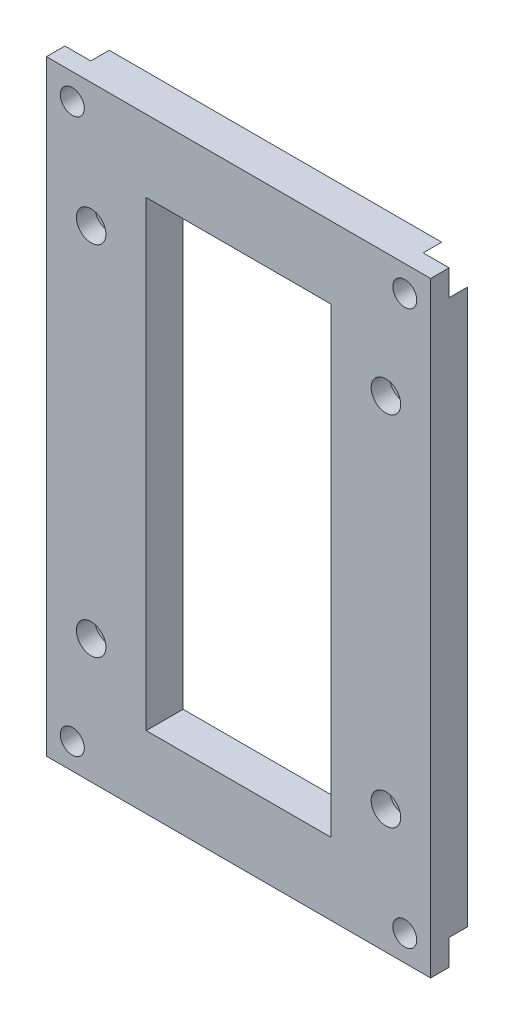
ISO-10303-21;
HEADER;
FILE_DESCRIPTION(('STEP AP214'),'2;1');
FILE_NAME('part.step','',(''),(''),'','','');
FILE_SCHEMA(('AUTOMOTIVE_DESIGN { 1 0 10303 214 1 1 1 1 }'));
ENDSEC;
DATA;
#1=APPLICATION_CONTEXT('core data for automotive mechanical design processes');
#2=APPLICATION_PROTOCOL_DEFINITION('international standard','automotive_design',2000,#1);
#3=PRODUCT_CONTEXT('',#1,'mechanical');
#4=PRODUCT('Part','Part','',(#3));
#5=PRODUCT_RELATED_PRODUCT_CATEGORY('part','',(#4));
#6=PRODUCT_DEFINITION_FORMATION('','',#4);
#7=PRODUCT_DEFINITION_CONTEXT('part definition',#1,'design');
#8=PRODUCT_DEFINITION('design','',#6,#7);
#9=PRODUCT_DEFINITION_SHAPE('','',#8);
#10=(LENGTH_UNIT() NAMED_UNIT(*) SI_UNIT(.MILLI.,.METRE.));
#11=(NAMED_UNIT(*) PLANE_ANGLE_UNIT() SI_UNIT($,.RADIAN.));
#12=(NAMED_UNIT(*) SI_UNIT($,.STERADIAN.) SOLID_ANGLE_UNIT());
#13=UNCERTAINTY_MEASURE_WITH_UNIT(LENGTH_MEASURE(1.E-05),#10,'distance_accuracy_value','');
#14=(GEOMETRIC_REPRESENTATION_CONTEXT(3) GLOBAL_UNCERTAINTY_ASSIGNED_CONTEXT((#13)) GLOBAL_UNIT_ASSIGNED_CONTEXT((#10,
#11,#12)) REPRESENTATION_CONTEXT('',''));
#15=CARTESIAN_POINT('',(0.,0.,0.));
#16=DIRECTION('',(0.,0.,1.));
#17=DIRECTION('',(1.,0.,0.));
#18=AXIS2_PLACEMENT_3D('',#15,#16,#17);
#19=CARTESIAN_POINT('',(-52.,0.,10.));
#20=DIRECTION('',(-1.,0.,0.));
#21=DIRECTION('',(0.,0.,1.));
#22=AXIS2_PLACEMENT_3D('',#19,#20,#21);
#23=PLANE('',#22);
#24=DIRECTION('',(0.,0.,-1.));
#25=VECTOR('',#24,1.);
#26=CARTESIAN_POINT('',(-52.,-75.,5.));
#27=LINE('',#26,#25);
#28=CARTESIAN_POINT('',(-52.,-75.,5.));
#29=VERTEX_POINT('',#28);
#30=CARTESIAN_POINT('',(-52.,-75.,0.));
#31=VERTEX_POINT('',#30);
#32=EDGE_CURVE('E247',#29,#31,#27,.T.);
#33=ORIENTED_EDGE('',*,*,#32,.F.);
#34=DIRECTION('',(0.,1.,0.));
#35=VECTOR('',#34,1.);
#36=CARTESIAN_POINT('',(-52.,0.,5.));
#37=LINE('',#36,#35);
#38=CARTESIAN_POINT('',(-52.,-82.,5.));
#39=VERTEX_POINT('',#38);
#40=EDGE_CURVE('E246',#39,#29,#37,.T.);
#41=ORIENTED_EDGE('',*,*,#40,.F.);
#42=DIRECTION('',(0.,0.,-1.));
#43=VECTOR('',#42,1.);
#44=CARTESIAN_POINT('',(-52.,-82.,10.));
#45=LINE('',#44,#43);
#46=CARTESIAN_POINT('',(-52.,-82.,10.));
#47=VERTEX_POINT('',#46);
#48=EDGE_CURVE('E12',#47,#39,#45,.T.);
#49=ORIENTED_EDGE('',*,*,#48,.F.);
#50=DIRECTION('',(0.,1.,0.));
#51=VECTOR('',#50,1.);
#52=CARTESIAN_POINT('',(-52.,0.,10.));
#53=LINE('',#52,#51);
#54=CARTESIAN_POINT('',(-52.,82.,10.));
#55=VERTEX_POINT('',#54);
#56=EDGE_CURVE('E378',#47,#55,#53,.T.);
#57=ORIENTED_EDGE('',*,*,#56,.T.);
#58=DIRECTION('',(0.,0.,-1.));
#59=VECTOR('',#58,1.);
#60=CARTESIAN_POINT('',(-52.,82.,10.));
#61=LINE('',#60,#59);
#62=CARTESIAN_POINT('',(-52.,82.,5.));
#63=VERTEX_POINT('',#62);
#64=EDGE_CURVE('E393',#55,#63,#61,.T.);
#65=ORIENTED_EDGE('',*,*,#64,.T.);
#66=DIRECTION('',(0.,1.,0.));
#67=VECTOR('',#66,1.);
#68=CARTESIAN_POINT('',(-52.,0.,5.));
#69=LINE('',#68,#67);
#70=CARTESIAN_POINT('',(-52.,75.,5.));
#71=VERTEX_POINT('',#70);
#72=EDGE_CURVE('E232',#71,#63,#69,.T.);
#73=ORIENTED_EDGE('',*,*,#72,.F.);
#74=DIRECTION('',(0.,0.,-1.));
#75=VECTOR('',#74,1.);
#76=CARTESIAN_POINT('',(-52.,75.,5.));
#77=LINE('',#76,#75);
#78=CARTESIAN_POINT('',(-52.,75.,0.));
#79=VERTEX_POINT('',#78);
#80=EDGE_CURVE('E215',#71,#79,#77,.T.);
#81=ORIENTED_EDGE('',*,*,#80,.T.);
#82=DIRECTION('',(0.,1.,0.));
#83=VECTOR('',#82,1.);
#84=CARTESIAN_POINT('',(-52.,0.,0.));
#85=LINE('',#84,#83);
#86=EDGE_CURVE('E360',#31,#79,#85,.T.);
#87=ORIENTED_EDGE('',*,*,#86,.F.);
#88=EDGE_LOOP('',(#33,#41,#49,#57,#65,#73,#81,#87));
#89=FACE_BOUND('',#88,.T.);
#90=ADVANCED_FACE('F52',(#89),#23,.T.);
#91=CARTESIAN_POINT('',(0.,-82.,10.));
#92=DIRECTION('',(0.,-1.,0.));
#93=DIRECTION('',(0.,0.,-1.));
#94=AXIS2_PLACEMENT_3D('',#91,#92,#93);
#95=PLANE('',#94);
#96=DIRECTION('',(0.,0.,-1.));
#97=VECTOR('',#96,1.);
#98=CARTESIAN_POINT('',(45.,-82.,5.));
#99=LINE('',#98,#97);
#100=CARTESIAN_POINT('',(45.,-82.,5.));
#101=VERTEX_POINT('',#100);
#102=CARTESIAN_POINT('',(45.,-82.,0.));
#103=VERTEX_POINT('',#102);
#104=EDGE_CURVE('E214',#101,#103,#99,.T.);
#105=ORIENTED_EDGE('',*,*,#104,.F.);
#106=DIRECTION('',(-1.,0.,0.));
#107=VECTOR('',#106,1.);
#108=CARTESIAN_POINT('',(0.,-82.,5.));
#109=LINE('',#108,#107);
#110=CARTESIAN_POINT('',(52.,-82.,5.));
#111=VERTEX_POINT('',#110);
#112=EDGE_CURVE('E271',#111,#101,#109,.T.);
#113=ORIENTED_EDGE('',*,*,#112,.F.);
#114=DIRECTION('',(0.,0.,-1.));
#115=VECTOR('',#114,1.);
#116=CARTESIAN_POINT('',(52.,-82.,10.));
#117=LINE('',#116,#115);
#118=CARTESIAN_POINT('',(52.,-82.,10.));
#119=VERTEX_POINT('',#118);
#120=EDGE_CURVE('E62',#119,#111,#117,.T.);
#121=ORIENTED_EDGE('',*,*,#120,.F.);
#122=DIRECTION('',(-1.,0.,0.));
#123=VECTOR('',#122,1.);
#124=CARTESIAN_POINT('',(0.,-82.,10.));
#125=LINE('',#124,#123);
#126=EDGE_CURVE('E382',#119,#47,#125,.T.);
#127=ORIENTED_EDGE('',*,*,#126,.T.);
#128=ORIENTED_EDGE('',*,*,#48,.T.);
#129=DIRECTION('',(-1.,0.,0.));
#130=VECTOR('',#129,1.);
#131=CARTESIAN_POINT('',(0.,-82.,5.));
#132=LINE('',#131,#130);
#133=CARTESIAN_POINT('',(-45.,-82.,5.));
#134=VERTEX_POINT('',#133);
#135=EDGE_CURVE('E257',#134,#39,#132,.T.);
#136=ORIENTED_EDGE('',*,*,#135,.F.);
#137=DIRECTION('',(0.,0.,-1.));
#138=VECTOR('',#137,1.);
#139=CARTESIAN_POINT('',(-45.,-82.,5.));
#140=LINE('',#139,#138);
#141=CARTESIAN_POINT('',(-45.,-82.,0.));
#142=VERTEX_POINT('',#141);
#143=EDGE_CURVE('E242',#134,#142,#140,.T.);
#144=ORIENTED_EDGE('',*,*,#143,.T.);
#145=DIRECTION('',(-1.,0.,0.));
#146=VECTOR('',#145,1.);
#147=CARTESIAN_POINT('',(0.,-82.,0.));
#148=LINE('',#147,#146);
#149=EDGE_CURVE('E397',#103,#142,#148,.T.);
#150=ORIENTED_EDGE('',*,*,#149,.F.);
#151=EDGE_LOOP('',(#105,#113,#121,#127,#128,#136,#144,#150));
#152=FACE_BOUND('',#151,.T.);
#153=ADVANCED_FACE('F452',(#152),#95,.T.);
#154=CARTESIAN_POINT('',(52.,0.,10.));
#155=DIRECTION('',(-1.,0.,0.));
#156=DIRECTION('',(0.,0.,1.));
#157=AXIS2_PLACEMENT_3D('',#154,#155,#156);
#158=PLANE('',#157);
#159=DIRECTION('',(0.,-1.,0.));
#160=VECTOR('',#159,1.);
#161=CARTESIAN_POINT('',(52.,0.,5.));
#162=LINE('',#161,#160);
#163=CARTESIAN_POINT('',(52.,-75.,5.));
#164=VERTEX_POINT('',#163);
#165=EDGE_CURVE('E280',#164,#111,#162,.T.);
#166=ORIENTED_EDGE('',*,*,#165,.F.);
#167=DIRECTION('',(0.,0.,-1.));
#168=VECTOR('',#167,1.);
#169=CARTESIAN_POINT('',(52.,-75.,5.));
#170=LINE('',#169,#168);
#171=CARTESIAN_POINT('',(52.,-75.,0.));
#172=VERTEX_POINT('',#171);
#173=EDGE_CURVE('E267',#164,#172,#170,.T.);
#174=ORIENTED_EDGE('',*,*,#173,.T.);
#175=DIRECTION('',(0.,1.,0.));
#176=VECTOR('',#175,1.);
#177=CARTESIAN_POINT('',(52.,0.,0.));
#178=LINE('',#177,#176);
#179=CARTESIAN_POINT('',(52.,75.,0.));
#180=VERTEX_POINT('',#179);
#181=EDGE_CURVE('E401',#172,#180,#178,.T.);
#182=ORIENTED_EDGE('',*,*,#181,.T.);
#183=DIRECTION('',(0.,0.,-1.));
#184=VECTOR('',#183,1.);
#185=CARTESIAN_POINT('',(52.,75.,5.));
#186=LINE('',#185,#184);
#187=CARTESIAN_POINT('',(52.,75.,5.));
#188=VERTEX_POINT('',#187);
#189=EDGE_CURVE('E304',#188,#180,#186,.T.);
#190=ORIENTED_EDGE('',*,*,#189,.F.);
#191=DIRECTION('',(0.,-1.,0.));
#192=VECTOR('',#191,1.);
#193=CARTESIAN_POINT('',(52.,0.,5.));
#194=LINE('',#193,#192);
#195=CARTESIAN_POINT('',(52.,82.,5.));
#196=VERTEX_POINT('',#195);
#197=EDGE_CURVE('E297',#196,#188,#194,.T.);
#198=ORIENTED_EDGE('',*,*,#197,.F.);
#199=DIRECTION('',(0.,0.,-1.));
#200=VECTOR('',#199,1.);
#201=CARTESIAN_POINT('',(52.,82.,10.));
#202=LINE('',#201,#200);
#203=CARTESIAN_POINT('',(52.,82.,10.));
#204=VERTEX_POINT('',#203);
#205=EDGE_CURVE('E411',#204,#196,#202,.T.);
#206=ORIENTED_EDGE('',*,*,#205,.F.);
#207=DIRECTION('',(0.,1.,0.));
#208=VECTOR('',#207,1.);
#209=CARTESIAN_POINT('',(52.,0.,10.));
#210=LINE('',#209,#208);
#211=EDGE_CURVE('E386',#119,#204,#210,.T.);
#212=ORIENTED_EDGE('',*,*,#211,.F.);
#213=ORIENTED_EDGE('',*,*,#120,.T.);
#214=EDGE_LOOP('',(#166,#174,#182,#190,#198,#206,#212,#213));
#215=FACE_BOUND('',#214,.T.);
#216=ADVANCED_FACE('F458',(#215),#158,.F.);
#217=CARTESIAN_POINT('',(45.,75.,10.));
#218=DIRECTION('',(0.,0.,-1.));
#219=DIRECTION('',(-1.,0.,0.));
#220=AXIS2_PLACEMENT_3D('',#217,#218,#219);
#221=CYLINDRICAL_SURFACE('',#220,3.25);
#222=CARTESIAN_POINT('',(45.,75.,10.));
#223=DIRECTION('',(0.,0.,1.));
#224=DIRECTION('',(1.,0.,0.));
#225=AXIS2_PLACEMENT_3D('',#222,#223,#224);
#226=CIRCLE('',#225,3.25);
#227=CARTESIAN_POINT('',(48.25,75.,10.));
#228=VERTEX_POINT('',#227);
#229=EDGE_CURVE('E374',#228,#228,#226,.T.);
#230=ORIENTED_EDGE('',*,*,#229,.T.);
#231=EDGE_LOOP('',(#230));
#232=FACE_BOUND('',#231,.T.);
#233=CARTESIAN_POINT('',(45.,75.,5.));
#234=DIRECTION('',(0.,0.,-1.));
#235=DIRECTION('',(-1.,0.,0.));
#236=AXIS2_PLACEMENT_3D('',#233,#234,#235);
#237=CIRCLE('',#236,3.25);
#238=CARTESIAN_POINT('',(41.75,75.,5.));
#239=VERTEX_POINT('',#238);
#240=EDGE_CURVE('E286',#239,#239,#237,.F.);
#241=ORIENTED_EDGE('',*,*,#240,.F.);
#242=EDGE_LOOP('',(#241));
#243=FACE_BOUND('',#242,.T.);
#244=ADVANCED_FACE('F464',(#232,#243),#221,.F.);
#245=CARTESIAN_POINT('',(45.,-75.,10.));
#246=DIRECTION('',(0.,0.,-1.));
#247=DIRECTION('',(-1.,0.,0.));
#248=AXIS2_PLACEMENT_3D('',#245,#246,#247);
#249=CYLINDRICAL_SURFACE('',#248,3.25);
#250=CARTESIAN_POINT('',(45.,-75.,10.));
#251=DIRECTION('',(0.,0.,1.));
#252=DIRECTION('',(1.,0.,0.));
#253=AXIS2_PLACEMENT_3D('',#250,#251,#252);
#254=CIRCLE('',#253,3.25);
#255=CARTESIAN_POINT('',(48.25,-75.,10.));
#256=VERTEX_POINT('',#255);
#257=EDGE_CURVE('E370',#256,#256,#254,.T.);
#258=ORIENTED_EDGE('',*,*,#257,.T.);
#259=EDGE_LOOP('',(#258));
#260=FACE_BOUND('',#259,.T.);
#261=CARTESIAN_POINT('',(45.,-75.,5.));
#262=DIRECTION('',(0.,0.,-1.));
#263=DIRECTION('',(-1.,0.,0.));
#264=AXIS2_PLACEMENT_3D('',#261,#262,#263);
#265=CIRCLE('',#264,3.25);
#266=CARTESIAN_POINT('',(41.75,-75.,5.));
#267=VERTEX_POINT('',#266);
#268=EDGE_CURVE('E56',#267,#267,#265,.T.);
#269=ORIENTED_EDGE('',*,*,#268,.T.);
#270=EDGE_LOOP('',(#269));
#271=FACE_BOUND('',#270,.T.);
#272=ADVANCED_FACE('F467',(#260,#271),#249,.F.);
#273=CARTESIAN_POINT('',(-45.,75.,10.));
#274=DIRECTION('',(0.,0.,-1.));
#275=DIRECTION('',(-1.,0.,0.));
#276=AXIS2_PLACEMENT_3D('',#273,#274,#275);
#277=CYLINDRICAL_SURFACE('',#276,3.25);
#278=CARTESIAN_POINT('',(-45.,75.,10.));
#279=DIRECTION('',(0.,0.,1.));
#280=DIRECTION('',(1.,0.,0.));
#281=AXIS2_PLACEMENT_3D('',#278,#279,#280);
#282=CIRCLE('',#281,3.25);
#283=CARTESIAN_POINT('',(-41.75,75.,10.));
#284=VERTEX_POINT('',#283);
#285=EDGE_CURVE('E365',#284,#284,#282,.T.);
#286=ORIENTED_EDGE('',*,*,#285,.T.);
#287=EDGE_LOOP('',(#286));
#288=FACE_BOUND('',#287,.T.);
#289=CARTESIAN_POINT('',(-45.,75.,5.));
#290=DIRECTION('',(0.,0.,-1.));
#291=DIRECTION('',(-1.,0.,0.));
#292=AXIS2_PLACEMENT_3D('',#289,#290,#291);
#293=CIRCLE('',#292,3.25);
#294=CARTESIAN_POINT('',(-48.25,75.,5.));
#295=VERTEX_POINT('',#294);
#296=EDGE_CURVE('E228',#295,#295,#293,.F.);
#297=ORIENTED_EDGE('',*,*,#296,.F.);
#298=EDGE_LOOP('',(#297));
#299=FACE_BOUND('',#298,.T.);
#300=ADVANCED_FACE('F470',(#288,#299),#277,.F.);
#301=CARTESIAN_POINT('',(-45.,-75.,10.));
#302=DIRECTION('',(0.,0.,-1.));
#303=DIRECTION('',(-1.,0.,0.));
#304=AXIS2_PLACEMENT_3D('',#301,#302,#303);
#305=CYLINDRICAL_SURFACE('',#304,3.25);
#306=CARTESIAN_POINT('',(-45.,-75.,10.));
#307=DIRECTION('',(0.,0.,1.));
#308=DIRECTION('',(1.,0.,0.));
#309=AXIS2_PLACEMENT_3D('',#306,#307,#308);
#310=CIRCLE('',#309,3.25);
#311=CARTESIAN_POINT('',(-41.75,-75.,10.));
#312=VERTEX_POINT('',#311);
#313=EDGE_CURVE('E361',#312,#312,#310,.T.);
#314=ORIENTED_EDGE('',*,*,#313,.T.);
#315=EDGE_LOOP('',(#314));
#316=FACE_BOUND('',#315,.T.);
#317=CARTESIAN_POINT('',(-45.,-75.,5.));
#318=DIRECTION('',(0.,0.,-1.));
#319=DIRECTION('',(-1.,0.,0.));
#320=AXIS2_PLACEMENT_3D('',#317,#318,#319);
#321=CIRCLE('',#320,3.25);
#322=CARTESIAN_POINT('',(-48.25,-75.,5.));
#323=VERTEX_POINT('',#322);
#324=EDGE_CURVE('E253',#323,#323,#321,.F.);
#325=ORIENTED_EDGE('',*,*,#324,.F.);
#326=EDGE_LOOP('',(#325));
#327=FACE_BOUND('',#326,.T.);
#328=ADVANCED_FACE('F54',(#316,#327),#305,.F.);
#329=CARTESIAN_POINT('',(0.,82.,10.));
#330=DIRECTION('',(0.,-1.,0.));
#331=DIRECTION('',(0.,0.,-1.));
#332=AXIS2_PLACEMENT_3D('',#329,#330,#331);
#333=PLANE('',#332);
#334=DIRECTION('',(0.,0.,-1.));
#335=VECTOR('',#334,1.);
#336=CARTESIAN_POINT('',(-45.,82.,5.));
#337=LINE('',#336,#335);
#338=CARTESIAN_POINT('',(-45.,82.,5.));
#339=VERTEX_POINT('',#338);
#340=CARTESIAN_POINT('',(-45.,82.,0.));
#341=VERTEX_POINT('',#340);
#342=EDGE_CURVE('E220',#339,#341,#337,.T.);
#343=ORIENTED_EDGE('',*,*,#342,.F.);
#344=DIRECTION('',(1.,0.,0.));
#345=VECTOR('',#344,1.);
#346=CARTESIAN_POINT('',(0.,82.,5.));
#347=LINE('',#346,#345);
#348=EDGE_CURVE('E219',#63,#339,#347,.T.);
#349=ORIENTED_EDGE('',*,*,#348,.F.);
#350=ORIENTED_EDGE('',*,*,#64,.F.);
#351=DIRECTION('',(-1.,0.,0.));
#352=VECTOR('',#351,1.);
#353=CARTESIAN_POINT('',(0.,82.,10.));
#354=LINE('',#353,#352);
#355=EDGE_CURVE('E390',#204,#55,#354,.T.);
#356=ORIENTED_EDGE('',*,*,#355,.F.);
#357=ORIENTED_EDGE('',*,*,#205,.T.);
#358=DIRECTION('',(1.,0.,0.));
#359=VECTOR('',#358,1.);
#360=CARTESIAN_POINT('',(0.,82.,5.));
#361=LINE('',#360,#359);
#362=CARTESIAN_POINT('',(45.,82.,5.));
#363=VERTEX_POINT('',#362);
#364=EDGE_CURVE('E294',#363,#196,#361,.T.);
#365=ORIENTED_EDGE('',*,*,#364,.F.);
#366=DIRECTION('',(0.,0.,-1.));
#367=VECTOR('',#366,1.);
#368=CARTESIAN_POINT('',(45.,82.,5.));
#369=LINE('',#368,#367);
#370=CARTESIAN_POINT('',(45.,82.,0.));
#371=VERTEX_POINT('',#370);
#372=EDGE_CURVE('E301',#363,#371,#369,.T.);
#373=ORIENTED_EDGE('',*,*,#372,.T.);
#374=DIRECTION('',(-1.,0.,0.));
#375=VECTOR('',#374,1.);
#376=CARTESIAN_POINT('',(0.,82.,0.));
#377=LINE('',#376,#375);
#378=EDGE_CURVE('E366',#371,#341,#377,.T.);
#379=ORIENTED_EDGE('',*,*,#378,.T.);
#380=EDGE_LOOP('',(#343,#349,#350,#356,#357,#365,#373,#379));
#381=FACE_BOUND('',#380,.T.);
#382=ADVANCED_FACE('F437',(#381),#333,.F.);
#383=CARTESIAN_POINT('',(39.9,48.4,10.));
#384=DIRECTION('',(0.,0.,-1.));
#385=DIRECTION('',(-1.,0.,0.));
#386=AXIS2_PLACEMENT_3D('',#383,#384,#385);
#387=CYLINDRICAL_SURFACE('',#386,1.625);
#388=CARTESIAN_POINT('',(39.9,48.4,0.));
#389=DIRECTION('',(0.,0.,-1.));
#390=DIRECTION('',(-1.,0.,0.));
#391=AXIS2_PLACEMENT_3D('',#388,#389,#390);
#392=CIRCLE('',#391,1.625);
#393=CARTESIAN_POINT('',(38.275,48.4,0.));
#394=VERTEX_POINT('',#393);
#395=EDGE_CURVE('E353',#394,#394,#392,.T.);
#396=ORIENTED_EDGE('',*,*,#395,.T.);
#397=EDGE_LOOP('',(#396));
#398=FACE_BOUND('',#397,.T.);
#399=CARTESIAN_POINT('',(39.9,48.4,5.));
#400=DIRECTION('',(0.,0.,1.));
#401=DIRECTION('',(1.,0.,0.));
#402=AXIS2_PLACEMENT_3D('',#399,#400,#401);
#403=CIRCLE('',#402,1.625);
#404=CARTESIAN_POINT('',(41.525,48.4,5.));
#405=VERTEX_POINT('',#404);
#406=EDGE_CURVE('E348',#405,#405,#403,.F.);
#407=ORIENTED_EDGE('',*,*,#406,.F.);
#408=EDGE_LOOP('',(#407));
#409=FACE_BOUND('',#408,.T.);
#410=ADVANCED_FACE('F434',(#398,#409),#387,.F.);
#411=CARTESIAN_POINT('',(-39.9,-48.4,10.));
#412=DIRECTION('',(0.,0.,-1.));
#413=DIRECTION('',(-1.,0.,0.));
#414=AXIS2_PLACEMENT_3D('',#411,#412,#413);
#415=CYLINDRICAL_SURFACE('',#414,1.625);
#416=CARTESIAN_POINT('',(-39.9,-48.4,0.));
#417=DIRECTION('',(0.,0.,-1.));
#418=DIRECTION('',(-1.,0.,0.));
#419=AXIS2_PLACEMENT_3D('',#416,#417,#418);
#420=CIRCLE('',#419,1.625);
#421=CARTESIAN_POINT('',(-41.525,-48.4,0.));
#422=VERTEX_POINT('',#421);
#423=EDGE_CURVE('E343',#422,#422,#420,.T.);
#424=ORIENTED_EDGE('',*,*,#423,.T.);
#425=EDGE_LOOP('',(#424));
#426=FACE_BOUND('',#425,.T.);
#427=CARTESIAN_POINT('',(-39.9,-48.4,5.));
#428=DIRECTION('',(0.,0.,1.));
#429=DIRECTION('',(1.,0.,0.));
#430=AXIS2_PLACEMENT_3D('',#427,#428,#429);
#431=CIRCLE('',#430,1.625);
#432=CARTESIAN_POINT('',(-38.275,-48.4,5.));
#433=VERTEX_POINT('',#432);
#434=EDGE_CURVE('E425',#433,#433,#431,.F.);
#435=ORIENTED_EDGE('',*,*,#434,.F.);
#436=EDGE_LOOP('',(#435));
#437=FACE_BOUND('',#436,.T.);
#438=ADVANCED_FACE('F436',(#426,#437),#415,.F.);
#439=CARTESIAN_POINT('',(39.9,-48.4,10.));
#440=DIRECTION('',(0.,0.,-1.));
#441=DIRECTION('',(-1.,0.,0.));
#442=AXIS2_PLACEMENT_3D('',#439,#440,#441);
#443=CYLINDRICAL_SURFACE('',#442,1.625);
#444=CARTESIAN_POINT('',(39.9,-48.4,0.));
#445=DIRECTION('',(0.,0.,-1.));
#446=DIRECTION('',(-1.,0.,0.));
#447=AXIS2_PLACEMENT_3D('',#444,#445,#446);
#448=CIRCLE('',#447,1.625);
#449=CARTESIAN_POINT('',(38.275,-48.4,0.));
#450=VERTEX_POINT('',#449);
#451=EDGE_CURVE('E347',#450,#450,#448,.T.);
#452=ORIENTED_EDGE('',*,*,#451,.T.);
#453=EDGE_LOOP('',(#452));
#454=FACE_BOUND('',#453,.T.);
#455=CARTESIAN_POINT('',(39.9,-48.4,5.));
#456=DIRECTION('',(0.,0.,1.));
#457=DIRECTION('',(1.,0.,0.));
#458=AXIS2_PLACEMENT_3D('',#455,#456,#457);
#459=CIRCLE('',#458,1.625);
#460=CARTESIAN_POINT('',(41.525,-48.4,5.));
#461=VERTEX_POINT('',#460);
#462=EDGE_CURVE('E421',#461,#461,#459,.F.);
#463=ORIENTED_EDGE('',*,*,#462,.F.);
#464=EDGE_LOOP('',(#463));
#465=FACE_BOUND('',#464,.T.);
#466=ADVANCED_FACE('F444',(#454,#465),#443,.F.);
#467=CARTESIAN_POINT('',(-39.9,48.4,10.));
#468=DIRECTION('',(0.,0.,-1.));
#469=DIRECTION('',(-1.,0.,0.));
#470=AXIS2_PLACEMENT_3D('',#467,#468,#469);
#471=CYLINDRICAL_SURFACE('',#470,1.625);
#472=CARTESIAN_POINT('',(-39.9,48.4,0.));
#473=DIRECTION('',(0.,0.,-1.));
#474=DIRECTION('',(-1.,0.,0.));
#475=AXIS2_PLACEMENT_3D('',#472,#473,#474);
#476=CIRCLE('',#475,1.625);
#477=CARTESIAN_POINT('',(-41.525,48.4,0.));
#478=VERTEX_POINT('',#477);
#479=EDGE_CURVE('E349',#478,#478,#476,.T.);
#480=ORIENTED_EDGE('',*,*,#479,.T.);
#481=EDGE_LOOP('',(#480));
#482=FACE_BOUND('',#481,.T.);
#483=CARTESIAN_POINT('',(-39.9,48.4,5.));
#484=DIRECTION('',(0.,0.,1.));
#485=DIRECTION('',(1.,0.,0.));
#486=AXIS2_PLACEMENT_3D('',#483,#484,#485);
#487=CIRCLE('',#486,1.625);
#488=CARTESIAN_POINT('',(-38.275,48.4,5.));
#489=VERTEX_POINT('',#488);
#490=EDGE_CURVE('E339',#489,#489,#487,.F.);
#491=ORIENTED_EDGE('',*,*,#490,.F.);
#492=EDGE_LOOP('',(#491));
#493=FACE_BOUND('',#492,.T.);
#494=ADVANCED_FACE('F578',(#482,#493),#471,.F.);
#495=CARTESIAN_POINT('',(0.,0.,10.));
#496=DIRECTION('',(0.,0.,1.));
#497=DIRECTION('',(1.,0.,0.));
#498=AXIS2_PLACEMENT_3D('',#495,#496,#497);
#499=PLANE('',#498);
#500=DIRECTION('',(0.,1.,0.));
#501=VECTOR('',#500,1.);
#502=CARTESIAN_POINT('',(25.,0.,10.));
#503=LINE('',#502,#501);
#504=CARTESIAN_POINT('',(25.,-62.5,10.));
#505=VERTEX_POINT('',#504);
#506=CARTESIAN_POINT('',(25.,62.5,10.));
#507=VERTEX_POINT('',#506);
#508=EDGE_CURVE('E211',#505,#507,#503,.T.);
#509=ORIENTED_EDGE('',*,*,#508,.F.);
#510=DIRECTION('',(1.,0.,0.));
#511=VECTOR('',#510,1.);
#512=CARTESIAN_POINT('',(0.,-62.5,10.));
#513=LINE('',#512,#511);
#514=CARTESIAN_POINT('',(-25.,-62.5,10.));
#515=VERTEX_POINT('',#514);
#516=EDGE_CURVE('E199',#515,#505,#513,.T.);
#517=ORIENTED_EDGE('',*,*,#516,.F.);
#518=DIRECTION('',(0.,-1.,0.));
#519=VECTOR('',#518,1.);
#520=CARTESIAN_POINT('',(-25.,0.,10.));
#521=LINE('',#520,#519);
#522=CARTESIAN_POINT('',(-25.,62.5,10.));
#523=VERTEX_POINT('',#522);
#524=EDGE_CURVE('E174',#523,#515,#521,.T.);
#525=ORIENTED_EDGE('',*,*,#524,.F.);
#526=DIRECTION('',(-1.,0.,0.));
#527=VECTOR('',#526,1.);
#528=CARTESIAN_POINT('',(0.,62.5,10.));
#529=LINE('',#528,#527);
#530=EDGE_CURVE('E208',#507,#523,#529,.T.);
#531=ORIENTED_EDGE('',*,*,#530,.F.);
#532=EDGE_LOOP('',(#509,#517,#525,#531));
#533=FACE_BOUND('',#532,.T.);
#534=CARTESIAN_POINT('',(39.9,48.4,10.));
#535=DIRECTION('',(0.,0.,1.));
#536=DIRECTION('',(1.,0.,0.));
#537=AXIS2_PLACEMENT_3D('',#534,#535,#536);
#538=CIRCLE('',#537,4.);
#539=CARTESIAN_POINT('',(43.9,48.4,10.));
#540=VERTEX_POINT('',#539);
#541=EDGE_CURVE('E324',#540,#540,#538,.T.);
#542=ORIENTED_EDGE('',*,*,#541,.F.);
#543=EDGE_LOOP('',(#542));
#544=FACE_BOUND('',#543,.T.);
#545=CARTESIAN_POINT('',(-39.9,-48.4,10.));
#546=DIRECTION('',(0.,0.,1.));
#547=DIRECTION('',(1.,0.,0.));
#548=AXIS2_PLACEMENT_3D('',#545,#546,#547);
#549=CIRCLE('',#548,4.);
#550=CARTESIAN_POINT('',(-35.9,-48.4,10.));
#551=VERTEX_POINT('',#550);
#552=EDGE_CURVE('E314',#551,#551,#549,.T.);
#553=ORIENTED_EDGE('',*,*,#552,.F.);
#554=EDGE_LOOP('',(#553));
#555=FACE_BOUND('',#554,.T.);
#556=CARTESIAN_POINT('',(39.9,-48.4,10.));
#557=DIRECTION('',(0.,0.,1.));
#558=DIRECTION('',(1.,0.,0.));
#559=AXIS2_PLACEMENT_3D('',#556,#557,#558);
#560=CIRCLE('',#559,4.);
#561=CARTESIAN_POINT('',(43.9,-48.4,10.));
#562=VERTEX_POINT('',#561);
#563=EDGE_CURVE('E315',#562,#562,#560,.T.);
#564=ORIENTED_EDGE('',*,*,#563,.F.);
#565=EDGE_LOOP('',(#564));
#566=FACE_BOUND('',#565,.T.);
#567=CARTESIAN_POINT('',(-39.9,48.4,10.));
#568=DIRECTION('',(0.,0.,1.));
#569=DIRECTION('',(1.,0.,0.));
#570=AXIS2_PLACEMENT_3D('',#567,#568,#569);
#571=CIRCLE('',#570,4.);
#572=CARTESIAN_POINT('',(-35.9,48.4,10.));
#573=VERTEX_POINT('',#572);
#574=EDGE_CURVE('E323',#573,#573,#571,.T.);
#575=ORIENTED_EDGE('',*,*,#574,.F.);
#576=EDGE_LOOP('',(#575));
#577=FACE_BOUND('',#576,.T.);
#578=ORIENTED_EDGE('',*,*,#313,.F.);
#579=EDGE_LOOP('',(#578));
#580=FACE_BOUND('',#579,.T.);
#581=ORIENTED_EDGE('',*,*,#285,.F.);
#582=EDGE_LOOP('',(#581));
#583=FACE_BOUND('',#582,.T.);
#584=ORIENTED_EDGE('',*,*,#257,.F.);
#585=EDGE_LOOP('',(#584));
#586=FACE_BOUND('',#585,.T.);
#587=ORIENTED_EDGE('',*,*,#229,.F.);
#588=EDGE_LOOP('',(#587));
#589=FACE_BOUND('',#588,.T.);
#590=ORIENTED_EDGE('',*,*,#56,.F.);
#591=ORIENTED_EDGE('',*,*,#126,.F.);
#592=ORIENTED_EDGE('',*,*,#211,.T.);
#593=ORIENTED_EDGE('',*,*,#355,.T.);
#594=EDGE_LOOP('',(#590,#591,#592,#593));
#595=FACE_BOUND('',#594,.T.);
#596=ADVANCED_FACE('F510',(#533,#544,#555,#566,#577,#580,#583,#586,#589,#595),#499,.T.);
#597=CARTESIAN_POINT('',(0.,0.,0.));
#598=DIRECTION('',(0.,0.,1.));
#599=DIRECTION('',(1.,0.,0.));
#600=AXIS2_PLACEMENT_3D('',#597,#598,#599);
#601=PLANE('',#600);
#602=DIRECTION('',(-1.,0.,0.));
#603=VECTOR('',#602,1.);
#604=CARTESIAN_POINT('',(-25.,-62.5,0.));
#605=LINE('',#604,#603);
#606=CARTESIAN_POINT('',(25.,-62.5,0.));
#607=VERTEX_POINT('',#606);
#608=CARTESIAN_POINT('',(-25.,-62.5,0.));
#609=VERTEX_POINT('',#608);
#610=EDGE_CURVE('E181',#607,#609,#605,.T.);
#611=ORIENTED_EDGE('',*,*,#610,.F.);
#612=DIRECTION('',(0.,-1.,0.));
#613=VECTOR('',#612,1.);
#614=CARTESIAN_POINT('',(25.,-62.5,0.));
#615=LINE('',#614,#613);
#616=CARTESIAN_POINT('',(25.,62.5,0.));
#617=VERTEX_POINT('',#616);
#618=EDGE_CURVE('E78',#617,#607,#615,.T.);
#619=ORIENTED_EDGE('',*,*,#618,.F.);
#620=DIRECTION('',(1.,0.,0.));
#621=VECTOR('',#620,1.);
#622=CARTESIAN_POINT('',(-25.,62.5,0.));
#623=LINE('',#622,#621);
#624=CARTESIAN_POINT('',(-25.,62.5,0.));
#625=VERTEX_POINT('',#624);
#626=EDGE_CURVE('E189',#625,#617,#623,.T.);
#627=ORIENTED_EDGE('',*,*,#626,.F.);
#628=DIRECTION('',(0.,1.,0.));
#629=VECTOR('',#628,1.);
#630=CARTESIAN_POINT('',(-25.,-62.5,0.));
#631=LINE('',#630,#629);
#632=EDGE_CURVE('E171',#609,#625,#631,.T.);
#633=ORIENTED_EDGE('',*,*,#632,.F.);
#634=EDGE_LOOP('',(#611,#619,#627,#633));
#635=FACE_BOUND('',#634,.T.);
#636=ORIENTED_EDGE('',*,*,#479,.F.);
#637=EDGE_LOOP('',(#636));
#638=FACE_BOUND('',#637,.T.);
#639=ORIENTED_EDGE('',*,*,#451,.F.);
#640=EDGE_LOOP('',(#639));
#641=FACE_BOUND('',#640,.T.);
#642=ORIENTED_EDGE('',*,*,#423,.F.);
#643=EDGE_LOOP('',(#642));
#644=FACE_BOUND('',#643,.T.);
#645=ORIENTED_EDGE('',*,*,#395,.F.);
#646=EDGE_LOOP('',(#645));
#647=FACE_BOUND('',#646,.T.);
#648=ORIENTED_EDGE('',*,*,#181,.F.);
#649=CARTESIAN_POINT('',(45.,-75.,0.));
#650=DIRECTION('',(0.,0.,-1.));
#651=DIRECTION('',(-1.,0.,0.));
#652=AXIS2_PLACEMENT_3D('',#649,#650,#651);
#653=CIRCLE('',#652,7.);
#654=EDGE_CURVE('E250',#103,#172,#653,.T.);
#655=ORIENTED_EDGE('',*,*,#654,.F.);
#656=ORIENTED_EDGE('',*,*,#149,.T.);
#657=CARTESIAN_POINT('',(-45.,-75.,0.));
#658=DIRECTION('',(0.,0.,-1.));
#659=DIRECTION('',(-1.,0.,0.));
#660=AXIS2_PLACEMENT_3D('',#657,#658,#659);
#661=CIRCLE('',#660,7.);
#662=EDGE_CURVE('E223',#31,#142,#661,.T.);
#663=ORIENTED_EDGE('',*,*,#662,.F.);
#664=ORIENTED_EDGE('',*,*,#86,.T.);
#665=CARTESIAN_POINT('',(-45.,75.,0.));
#666=DIRECTION('',(0.,0.,-1.));
#667=DIRECTION('',(-1.,0.,0.));
#668=AXIS2_PLACEMENT_3D('',#665,#666,#667);
#669=CIRCLE('',#668,6.99999999999999);
#670=EDGE_CURVE('E224',#341,#79,#669,.T.);
#671=ORIENTED_EDGE('',*,*,#670,.F.);
#672=ORIENTED_EDGE('',*,*,#378,.F.);
#673=CARTESIAN_POINT('',(45.,75.,0.));
#674=DIRECTION('',(0.,0.,-1.));
#675=DIRECTION('',(-1.,0.,0.));
#676=AXIS2_PLACEMENT_3D('',#673,#674,#675);
#677=CIRCLE('',#676,7.);
#678=EDGE_CURVE('E227',#180,#371,#677,.T.);
#679=ORIENTED_EDGE('',*,*,#678,.F.);
#680=EDGE_LOOP('',(#648,#655,#656,#663,#664,#671,#672,#679));
#681=FACE_BOUND('',#680,.T.);
#682=ADVANCED_FACE('F186',(#635,#638,#641,#644,#647,#681),#601,.F.);
#683=CARTESIAN_POINT('',(-39.9,48.4,5.));
#684=DIRECTION('',(0.,0.,1.));
#685=DIRECTION('',(1.,0.,0.));
#686=AXIS2_PLACEMENT_3D('',#683,#684,#685);
#687=PLANE('',#686);
#688=CARTESIAN_POINT('',(-39.9,48.4,5.));
#689=DIRECTION('',(0.,0.,1.));
#690=DIRECTION('',(1.,0.,0.));
#691=AXIS2_PLACEMENT_3D('',#688,#689,#690);
#692=CIRCLE('',#691,4.);
#693=CARTESIAN_POINT('',(-35.9,48.4,5.));
#694=VERTEX_POINT('',#693);
#695=EDGE_CURVE('E335',#694,#694,#692,.T.);
#696=ORIENTED_EDGE('',*,*,#695,.T.);
#697=EDGE_LOOP('',(#696));
#698=FACE_BOUND('',#697,.T.);
#699=ORIENTED_EDGE('',*,*,#490,.T.);
#700=EDGE_LOOP('',(#699));
#701=FACE_BOUND('',#700,.T.);
#702=ADVANCED_FACE('F571',(#698,#701),#687,.T.);
#703=CARTESIAN_POINT('',(-39.9,48.4,5.));
#704=DIRECTION('',(0.,0.,1.));
#705=DIRECTION('',(1.,0.,0.));
#706=AXIS2_PLACEMENT_3D('',#703,#704,#705);
#707=CYLINDRICAL_SURFACE('',#706,4.);
#708=ORIENTED_EDGE('',*,*,#695,.F.);
#709=EDGE_LOOP('',(#708));
#710=FACE_BOUND('',#709,.T.);
#711=ORIENTED_EDGE('',*,*,#574,.T.);
#712=EDGE_LOOP('',(#711));
#713=FACE_BOUND('',#712,.T.);
#714=ADVANCED_FACE('F552',(#710,#713),#707,.F.);
#715=CARTESIAN_POINT('',(39.9,-48.4,5.));
#716=DIRECTION('',(0.,0.,1.));
#717=DIRECTION('',(1.,0.,0.));
#718=AXIS2_PLACEMENT_3D('',#715,#716,#717);
#719=PLANE('',#718);
#720=CARTESIAN_POINT('',(39.9,-48.4,5.));
#721=DIRECTION('',(0.,0.,1.));
#722=DIRECTION('',(1.,0.,0.));
#723=AXIS2_PLACEMENT_3D('',#720,#721,#722);
#724=CIRCLE('',#723,4.);
#725=CARTESIAN_POINT('',(43.9,-48.4,5.));
#726=VERTEX_POINT('',#725);
#727=EDGE_CURVE('E310',#726,#726,#724,.T.);
#728=ORIENTED_EDGE('',*,*,#727,.T.);
#729=EDGE_LOOP('',(#728));
#730=FACE_BOUND('',#729,.T.);
#731=ORIENTED_EDGE('',*,*,#462,.T.);
#732=EDGE_LOOP('',(#731));
#733=FACE_BOUND('',#732,.T.);
#734=ADVANCED_FACE('F548',(#730,#733),#719,.T.);
#735=CARTESIAN_POINT('',(39.9,-48.4,5.));
#736=DIRECTION('',(0.,0.,1.));
#737=DIRECTION('',(1.,0.,0.));
#738=AXIS2_PLACEMENT_3D('',#735,#736,#737);
#739=CYLINDRICAL_SURFACE('',#738,4.);
#740=ORIENTED_EDGE('',*,*,#727,.F.);
#741=EDGE_LOOP('',(#740));
#742=FACE_BOUND('',#741,.T.);
#743=ORIENTED_EDGE('',*,*,#563,.T.);
#744=EDGE_LOOP('',(#743));
#745=FACE_BOUND('',#744,.T.);
#746=ADVANCED_FACE('F551',(#742,#745),#739,.F.);
#747=CARTESIAN_POINT('',(-39.9,-48.4,5.));
#748=DIRECTION('',(0.,0.,1.));
#749=DIRECTION('',(1.,0.,0.));
#750=AXIS2_PLACEMENT_3D('',#747,#748,#749);
#751=PLANE('',#750);
#752=CARTESIAN_POINT('',(-39.9,-48.4,5.));
#753=DIRECTION('',(0.,0.,1.));
#754=DIRECTION('',(1.,0.,0.));
#755=AXIS2_PLACEMENT_3D('',#752,#753,#754);
#756=CIRCLE('',#755,4.);
#757=CARTESIAN_POINT('',(-35.9,-48.4,5.));
#758=VERTEX_POINT('',#757);
#759=EDGE_CURVE('E328',#758,#758,#756,.T.);
#760=ORIENTED_EDGE('',*,*,#759,.T.);
#761=EDGE_LOOP('',(#760));
#762=FACE_BOUND('',#761,.T.);
#763=ORIENTED_EDGE('',*,*,#434,.T.);
#764=EDGE_LOOP('',(#763));
#765=FACE_BOUND('',#764,.T.);
#766=ADVANCED_FACE('F556',(#762,#765),#751,.T.);
#767=CARTESIAN_POINT('',(-39.9,-48.4,5.));
#768=DIRECTION('',(0.,0.,1.));
#769=DIRECTION('',(1.,0.,0.));
#770=AXIS2_PLACEMENT_3D('',#767,#768,#769);
#771=CYLINDRICAL_SURFACE('',#770,4.);
#772=ORIENTED_EDGE('',*,*,#759,.F.);
#773=EDGE_LOOP('',(#772));
#774=FACE_BOUND('',#773,.T.);
#775=ORIENTED_EDGE('',*,*,#552,.T.);
#776=EDGE_LOOP('',(#775));
#777=FACE_BOUND('',#776,.T.);
#778=ADVANCED_FACE('F560',(#774,#777),#771,.F.);
#779=CARTESIAN_POINT('',(39.9,48.4,5.));
#780=DIRECTION('',(0.,0.,1.));
#781=DIRECTION('',(1.,0.,0.));
#782=AXIS2_PLACEMENT_3D('',#779,#780,#781);
#783=PLANE('',#782);
#784=CARTESIAN_POINT('',(39.9,48.4,5.));
#785=DIRECTION('',(0.,0.,1.));
#786=DIRECTION('',(1.,0.,0.));
#787=AXIS2_PLACEMENT_3D('',#784,#785,#786);
#788=CIRCLE('',#787,4.);
#789=CARTESIAN_POINT('',(43.9,48.4,5.));
#790=VERTEX_POINT('',#789);
#791=EDGE_CURVE('E319',#790,#790,#788,.T.);
#792=ORIENTED_EDGE('',*,*,#791,.T.);
#793=EDGE_LOOP('',(#792));
#794=FACE_BOUND('',#793,.T.);
#795=ORIENTED_EDGE('',*,*,#406,.T.);
#796=EDGE_LOOP('',(#795));
#797=FACE_BOUND('',#796,.T.);
#798=ADVANCED_FACE('F432',(#794,#797),#783,.T.);
#799=CARTESIAN_POINT('',(39.9,48.4,5.));
#800=DIRECTION('',(0.,0.,1.));
#801=DIRECTION('',(1.,0.,0.));
#802=AXIS2_PLACEMENT_3D('',#799,#800,#801);
#803=CYLINDRICAL_SURFACE('',#802,4.);
#804=ORIENTED_EDGE('',*,*,#791,.F.);
#805=EDGE_LOOP('',(#804));
#806=FACE_BOUND('',#805,.T.);
#807=ORIENTED_EDGE('',*,*,#541,.T.);
#808=EDGE_LOOP('',(#807));
#809=FACE_BOUND('',#808,.T.);
#810=ADVANCED_FACE('F547',(#806,#809),#803,.F.);
#811=CARTESIAN_POINT('',(45.,75.,5.));
#812=DIRECTION('',(0.,0.,-1.));
#813=DIRECTION('',(-1.,0.,0.));
#814=AXIS2_PLACEMENT_3D('',#811,#812,#813);
#815=CYLINDRICAL_SURFACE('',#814,7.);
#816=ORIENTED_EDGE('',*,*,#678,.T.);
#817=ORIENTED_EDGE('',*,*,#372,.F.);
#818=CARTESIAN_POINT('',(45.,75.,5.));
#819=DIRECTION('',(0.,0.,-1.));
#820=DIRECTION('',(-1.,0.,0.));
#821=AXIS2_PLACEMENT_3D('',#818,#819,#820);
#822=CIRCLE('',#821,7.);
#823=EDGE_CURVE('E290',#188,#363,#822,.T.);
#824=ORIENTED_EDGE('',*,*,#823,.F.);
#825=ORIENTED_EDGE('',*,*,#189,.T.);
#826=EDGE_LOOP('',(#816,#817,#824,#825));
#827=FACE_BOUND('',#826,.T.);
#828=ADVANCED_FACE('F521',(#827),#815,.F.);
#829=CARTESIAN_POINT('',(0.,0.,5.));
#830=DIRECTION('',(0.,0.,-1.));
#831=DIRECTION('',(-1.,0.,0.));
#832=AXIS2_PLACEMENT_3D('',#829,#830,#831);
#833=PLANE('',#832);
#834=ORIENTED_EDGE('',*,*,#240,.T.);
#835=EDGE_LOOP('',(#834));
#836=FACE_BOUND('',#835,.T.);
#837=ORIENTED_EDGE('',*,*,#823,.T.);
#838=ORIENTED_EDGE('',*,*,#364,.T.);
#839=ORIENTED_EDGE('',*,*,#197,.T.);
#840=EDGE_LOOP('',(#837,#838,#839));
#841=FACE_BOUND('',#840,.T.);
#842=ADVANCED_FACE('F519',(#836,#841),#833,.T.);
#843=CARTESIAN_POINT('',(-45.,75.,5.));
#844=DIRECTION('',(0.,0.,-1.));
#845=DIRECTION('',(-1.,0.,0.));
#846=AXIS2_PLACEMENT_3D('',#843,#844,#845);
#847=CYLINDRICAL_SURFACE('',#846,6.99999999999999);
#848=ORIENTED_EDGE('',*,*,#670,.T.);
#849=ORIENTED_EDGE('',*,*,#80,.F.);
#850=CARTESIAN_POINT('',(-45.,75.,5.));
#851=DIRECTION('',(0.,0.,-1.));
#852=DIRECTION('',(-1.,0.,0.));
#853=AXIS2_PLACEMENT_3D('',#850,#851,#852);
#854=CIRCLE('',#853,6.99999999999999);
#855=EDGE_CURVE('E235',#339,#71,#854,.T.);
#856=ORIENTED_EDGE('',*,*,#855,.F.);
#857=ORIENTED_EDGE('',*,*,#342,.T.);
#858=EDGE_LOOP('',(#848,#849,#856,#857));
#859=FACE_BOUND('',#858,.T.);
#860=ADVANCED_FACE('F486',(#859),#847,.F.);
#861=CARTESIAN_POINT('',(0.,0.,5.));
#862=DIRECTION('',(0.,0.,-1.));
#863=DIRECTION('',(-1.,0.,0.));
#864=AXIS2_PLACEMENT_3D('',#861,#862,#863);
#865=PLANE('',#864);
#866=ORIENTED_EDGE('',*,*,#296,.T.);
#867=EDGE_LOOP('',(#866));
#868=FACE_BOUND('',#867,.T.);
#869=ORIENTED_EDGE('',*,*,#855,.T.);
#870=ORIENTED_EDGE('',*,*,#72,.T.);
#871=ORIENTED_EDGE('',*,*,#348,.T.);
#872=EDGE_LOOP('',(#869,#870,#871));
#873=FACE_BOUND('',#872,.T.);
#874=ADVANCED_FACE('F482',(#868,#873),#865,.T.);
#875=CARTESIAN_POINT('',(-45.,-75.,5.));
#876=DIRECTION('',(0.,0.,-1.));
#877=DIRECTION('',(-1.,0.,0.));
#878=AXIS2_PLACEMENT_3D('',#875,#876,#877);
#879=CYLINDRICAL_SURFACE('',#878,7.);
#880=ORIENTED_EDGE('',*,*,#662,.T.);
#881=ORIENTED_EDGE('',*,*,#143,.F.);
#882=CARTESIAN_POINT('',(-45.,-75.,5.));
#883=DIRECTION('',(0.,0.,-1.));
#884=DIRECTION('',(-1.,0.,0.));
#885=AXIS2_PLACEMENT_3D('',#882,#883,#884);
#886=CIRCLE('',#885,7.);
#887=EDGE_CURVE('E260',#29,#134,#886,.T.);
#888=ORIENTED_EDGE('',*,*,#887,.F.);
#889=ORIENTED_EDGE('',*,*,#32,.T.);
#890=EDGE_LOOP('',(#880,#881,#888,#889));
#891=FACE_BOUND('',#890,.T.);
#892=ADVANCED_FACE('F485',(#891),#879,.F.);
#893=CARTESIAN_POINT('',(0.,0.,5.));
#894=DIRECTION('',(0.,0.,-1.));
#895=DIRECTION('',(-1.,0.,0.));
#896=AXIS2_PLACEMENT_3D('',#893,#894,#895);
#897=PLANE('',#896);
#898=ORIENTED_EDGE('',*,*,#324,.T.);
#899=EDGE_LOOP('',(#898));
#900=FACE_BOUND('',#899,.T.);
#901=ORIENTED_EDGE('',*,*,#887,.T.);
#902=ORIENTED_EDGE('',*,*,#135,.T.);
#903=ORIENTED_EDGE('',*,*,#40,.T.);
#904=EDGE_LOOP('',(#901,#902,#903));
#905=FACE_BOUND('',#904,.T.);
#906=ADVANCED_FACE('F505',(#900,#905),#897,.T.);
#907=CARTESIAN_POINT('',(45.,-75.,5.));
#908=DIRECTION('',(0.,0.,-1.));
#909=DIRECTION('',(-1.,0.,0.));
#910=AXIS2_PLACEMENT_3D('',#907,#908,#909);
#911=CYLINDRICAL_SURFACE('',#910,7.);
#912=ORIENTED_EDGE('',*,*,#654,.T.);
#913=ORIENTED_EDGE('',*,*,#173,.F.);
#914=CARTESIAN_POINT('',(45.,-75.,5.));
#915=DIRECTION('',(0.,0.,-1.));
#916=DIRECTION('',(-1.,0.,0.));
#917=AXIS2_PLACEMENT_3D('',#914,#915,#916);
#918=CIRCLE('',#917,7.);
#919=EDGE_CURVE('E276',#101,#164,#918,.T.);
#920=ORIENTED_EDGE('',*,*,#919,.F.);
#921=ORIENTED_EDGE('',*,*,#104,.T.);
#922=EDGE_LOOP('',(#912,#913,#920,#921));
#923=FACE_BOUND('',#922,.T.);
#924=ADVANCED_FACE('F524',(#923),#911,.F.);
#925=CARTESIAN_POINT('',(0.,0.,5.));
#926=DIRECTION('',(0.,0.,-1.));
#927=DIRECTION('',(-1.,0.,0.));
#928=AXIS2_PLACEMENT_3D('',#925,#926,#927);
#929=PLANE('',#928);
#930=ORIENTED_EDGE('',*,*,#268,.F.);
#931=EDGE_LOOP('',(#930));
#932=FACE_BOUND('',#931,.T.);
#933=ORIENTED_EDGE('',*,*,#919,.T.);
#934=ORIENTED_EDGE('',*,*,#165,.T.);
#935=ORIENTED_EDGE('',*,*,#112,.T.);
#936=EDGE_LOOP('',(#933,#934,#935));
#937=FACE_BOUND('',#936,.T.);
#938=ADVANCED_FACE('F526',(#932,#937),#929,.T.);
#939=CARTESIAN_POINT('',(25.,-62.5,52.));
#940=DIRECTION('',(1.,0.,0.));
#941=DIRECTION('',(0.,0.,-1.));
#942=AXIS2_PLACEMENT_3D('',#939,#940,#941);
#943=PLANE('',#942);
#944=ORIENTED_EDGE('',*,*,#508,.T.);
#945=DIRECTION('',(0.,0.,-1.));
#946=VECTOR('',#945,1.);
#947=CARTESIAN_POINT('',(25.,62.5,52.));
#948=LINE('',#947,#946);
#949=EDGE_CURVE('E196',#507,#617,#948,.T.);
#950=ORIENTED_EDGE('',*,*,#949,.T.);
#951=ORIENTED_EDGE('',*,*,#618,.T.);
#952=DIRECTION('',(0.,0.,-1.));
#953=VECTOR('',#952,1.);
#954=CARTESIAN_POINT('',(25.,-62.5,52.));
#955=LINE('',#954,#953);
#956=EDGE_CURVE('E178',#505,#607,#955,.T.);
#957=ORIENTED_EDGE('',*,*,#956,.F.);
#958=EDGE_LOOP('',(#944,#950,#951,#957));
#959=FACE_BOUND('',#958,.T.);
#960=ADVANCED_FACE('F529',(#959),#943,.F.);
#961=CARTESIAN_POINT('',(-25.,62.5,52.));
#962=DIRECTION('',(0.,1.,0.));
#963=DIRECTION('',(0.,0.,1.));
#964=AXIS2_PLACEMENT_3D('',#961,#962,#963);
#965=PLANE('',#964);
#966=ORIENTED_EDGE('',*,*,#530,.T.);
#967=DIRECTION('',(0.,0.,-1.));
#968=VECTOR('',#967,1.);
#969=CARTESIAN_POINT('',(-25.,62.5,52.));
#970=LINE('',#969,#968);
#971=EDGE_CURVE('E177',#523,#625,#970,.T.);
#972=ORIENTED_EDGE('',*,*,#971,.T.);
#973=ORIENTED_EDGE('',*,*,#626,.T.);
#974=ORIENTED_EDGE('',*,*,#949,.F.);
#975=EDGE_LOOP('',(#966,#972,#973,#974));
#976=FACE_BOUND('',#975,.T.);
#977=ADVANCED_FACE('F536',(#976),#965,.F.);
#978=CARTESIAN_POINT('',(-25.,-62.5,52.));
#979=DIRECTION('',(-1.,0.,0.));
#980=DIRECTION('',(0.,0.,1.));
#981=AXIS2_PLACEMENT_3D('',#978,#979,#980);
#982=PLANE('',#981);
#983=ORIENTED_EDGE('',*,*,#524,.T.);
#984=DIRECTION('',(0.,0.,-1.));
#985=VECTOR('',#984,1.);
#986=CARTESIAN_POINT('',(-25.,-62.5,52.));
#987=LINE('',#986,#985);
#988=EDGE_CURVE('E70',#515,#609,#987,.T.);
#989=ORIENTED_EDGE('',*,*,#988,.T.);
#990=ORIENTED_EDGE('',*,*,#632,.T.);
#991=ORIENTED_EDGE('',*,*,#971,.F.);
#992=EDGE_LOOP('',(#983,#989,#990,#991));
#993=FACE_BOUND('',#992,.T.);
#994=ADVANCED_FACE('F168',(#993),#982,.F.);
#995=CARTESIAN_POINT('',(-25.,-62.5,52.));
#996=DIRECTION('',(0.,-1.,0.));
#997=DIRECTION('',(0.,0.,-1.));
#998=AXIS2_PLACEMENT_3D('',#995,#996,#997);
#999=PLANE('',#998);
#1000=ORIENTED_EDGE('',*,*,#516,.T.);
#1001=ORIENTED_EDGE('',*,*,#956,.T.);
#1002=ORIENTED_EDGE('',*,*,#610,.T.);
#1003=ORIENTED_EDGE('',*,*,#988,.F.);
#1004=EDGE_LOOP('',(#1000,#1001,#1002,#1003));
#1005=FACE_BOUND('',#1004,.T.);
#1006=ADVANCED_FACE('F182',(#1005),#999,.F.);
#1007=CLOSED_SHELL('',(#90,#153,#216,#244,#272,#300,#328,#382,#410,#438,#466,#494,#596,#682,
#702,#714,#734,#746,#766,#778,#798,#810,#828,#842,#860,#874,#892,#906,#924,#938,#960,#977,#994,#1006));
#1008=MANIFOLD_SOLID_BREP('B2',#1007);
#1009=ADVANCED_BREP_SHAPE_REPRESENTATION('',(#18,#1008),#14);
#1010=SHAPE_DEFINITION_REPRESENTATION(#9,#1009);
ENDSEC;
END-ISO-10303-21;
